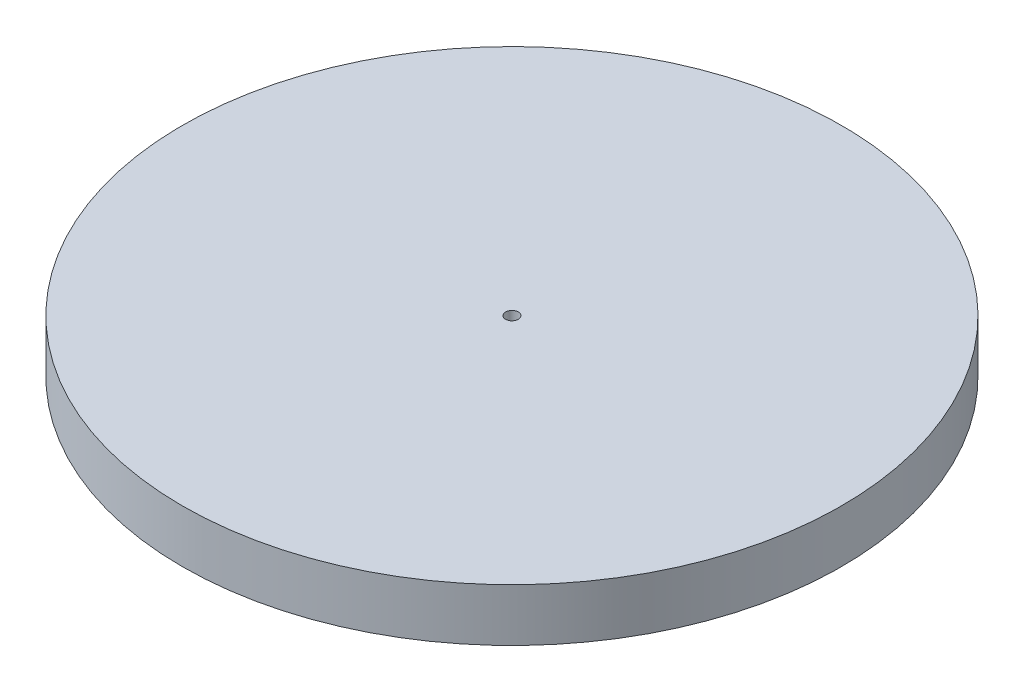
ISO-10303-21;
HEADER;
FILE_DESCRIPTION(('STEP AP214'),'2;1');
FILE_NAME('part.step','',(''),(''),'','','');
FILE_SCHEMA(('AUTOMOTIVE_DESIGN { 1 0 10303 214 1 1 1 1 }'));
ENDSEC;
DATA;
#1=APPLICATION_CONTEXT('core data for automotive mechanical design processes');
#2=APPLICATION_PROTOCOL_DEFINITION('international standard','automotive_design',2000,#1);
#3=PRODUCT_CONTEXT('',#1,'mechanical');
#4=PRODUCT('Part','Part','',(#3));
#5=PRODUCT_RELATED_PRODUCT_CATEGORY('part','',(#4));
#6=PRODUCT_DEFINITION_FORMATION('','',#4);
#7=PRODUCT_DEFINITION_CONTEXT('part definition',#1,'design');
#8=PRODUCT_DEFINITION('design','',#6,#7);
#9=PRODUCT_DEFINITION_SHAPE('','',#8);
#10=(LENGTH_UNIT() NAMED_UNIT(*) SI_UNIT(.MILLI.,.METRE.));
#11=(NAMED_UNIT(*) PLANE_ANGLE_UNIT() SI_UNIT($,.RADIAN.));
#12=(NAMED_UNIT(*) SI_UNIT($,.STERADIAN.) SOLID_ANGLE_UNIT());
#13=UNCERTAINTY_MEASURE_WITH_UNIT(LENGTH_MEASURE(1.E-05),#10,'distance_accuracy_value','');
#14=(GEOMETRIC_REPRESENTATION_CONTEXT(3) GLOBAL_UNCERTAINTY_ASSIGNED_CONTEXT((#13)) GLOBAL_UNIT_ASSIGNED_CONTEXT((#10,
#11,#12)) REPRESENTATION_CONTEXT('',''));
#15=CARTESIAN_POINT('',(0.,0.,0.));
#16=DIRECTION('',(0.,0.,1.));
#17=DIRECTION('',(1.,0.,0.));
#18=AXIS2_PLACEMENT_3D('',#15,#16,#17);
#19=CARTESIAN_POINT('',(-1.66935369233034E-12,0.,0.));
#20=CARTESIAN_POINT('',(0.0160193190524228,-0.000318054856775744,0.));
#21=CARTESIAN_POINT('',(0.0473639566251672,-0.000435510550509003,0.));
#22=CARTESIAN_POINT('',(0.124565154527215,0.000266609481892512,0.));
#23=CARTESIAN_POINT('',(0.188009447782362,0.00478488924538861,0.));
#24=CARTESIAN_POINT('',(0.302162396783634,0.014312965244326,0.));
#25=CARTESIAN_POINT('',(0.434906427325045,0.0337053179774558,0.));
#26=CARTESIAN_POINT('',(0.591621889336675,0.064644454449584,0.));
#27=CARTESIAN_POINT('',(0.758367432559395,0.10898808388091,0.));
#28=CARTESIAN_POINT('',(0.948542261906713,0.167874068193784,0.));
#29=CARTESIAN_POINT('',(1.14842191793434,0.240807637396926,0.));
#30=CARTESIAN_POINT('',(1.37199511300923,0.333716385655303,0.));
#31=CARTESIAN_POINT('',(1.61633285204612,0.447951627884762,0.));
#32=CARTESIAN_POINT('',(1.84949067280304,0.56620763699856,0.));
#33=CARTESIAN_POINT('',(2.08788871807308,0.695473703724883,0.));
#34=CARTESIAN_POINT('',(2.3320591278058,0.835246825901475,0.));
#35=CARTESIAN_POINT('',(2.58184161033338,0.985088881639972,0.));
#36=CARTESIAN_POINT('',(2.83752543271208,1.14450063522169,0.));
#37=CARTESIAN_POINT('',(3.28091081632111,1.42994042502417,0.));
#38=CARTESIAN_POINT('',(3.98720303124764,1.90885241036084,0.));
#39=CARTESIAN_POINT('',(4.78289528664414,2.47902436951218,0.));
#40=CARTESIAN_POINT('',(5.67017795522472,3.13576814221697,0.));
#41=CARTESIAN_POINT('',(6.95211968249608,4.10259363400245,0.));
#42=CARTESIAN_POINT('',(8.54259141017841,5.32584584689984,0.));
#43=CARTESIAN_POINT('',(10.6041959334969,6.92559694324808,0.));
#44=CARTESIAN_POINT('',(12.8265834223268,8.64299328127692,0.));
#45=CARTESIAN_POINT('',(14.7393250682949,10.1080268866887,0.));
#46=CARTESIAN_POINT('',(16.6560805223715,11.5628348770098,0.));
#47=CARTESIAN_POINT('',(18.2636412114255,12.770152933313,0.));
#48=CARTESIAN_POINT('',(19.8694312602965,13.9632472606054,0.));
#49=CARTESIAN_POINT('',(21.4945573297555,15.1564003029726,0.));
#50=CARTESIAN_POINT('',(22.7794973285683,16.0923400899708,0.));
#51=CARTESIAN_POINT('',(24.1049555139759,17.0475744908639,0.));
#52=CARTESIAN_POINT('',(25.3717523625864,17.9540927974031,0.));
#53=CARTESIAN_POINT('',(27.0889047476091,19.1684619765692,0.));
#54=CARTESIAN_POINT('',(28.2529017866212,19.9854061201744,0.));
#55=CARTESIAN_POINT('',(29.4493043905454,20.8124595028871,0.));
#56=CARTESIAN_POINT('',(30.0000000000689,21.1926006575352,0.));
#57=B_SPLINE_CURVE_WITH_KNOTS('',4,(#19,#20,#21,#22,#23,#24,#25,#26,#27,#28,#29,#30,#31,#32,#33,
#34,#35,#36,#37,#38,#39,#40,#41,#42,#43,#44,#45,#46,#47,#48,#49,#50,#51,#52,#53,#54,#55,#56),
.UNSPECIFIED.,.F.,.F.,(5,1,1,1,1,1,1,1,1,1,1,1,1,1,1,1,1,1,1,1,1,1,1,1,1,1,1,1,1,1,1,1,1,1,5),
(0.0832282933178679,0.0849668084394803,0.0867053235610927,0.088443838682705,0.0901823538043174,
0.0947159816381905,0.0992496094720637,0.102595876988796,0.105942144505529,0.112634679538994,
0.118542034753024,0.124449389967053,0.130356745181083,0.136264100395113,0.143077265738694,
0.149890431082276,0.156703596425858,0.16351676176944,0.190769423143767,0.227072871122881,
0.245224595112438,0.263376319101995,0.335983215624438,0.408590105179713,0.481196988245663,
0.517500432975978,0.553803877706294,0.626410759768741,0.662714204314046,0.69901764885935,
0.735321089529334,0.771624530199317,0.80792797418639,0.844231418173463,0.916838297047539),.UNSPECIFIED.);
#58=CARTESIAN_POINT('',(0.,40.,0.));
#59=DIRECTION('',(0.,1.,0.));
#60=AXIS1_PLACEMENT('',#58,#59);
#61=SURFACE_OF_REVOLUTION('',#57,#60);
#62=CARTESIAN_POINT('',(0.,0.263779101853469,0.));
#63=DIRECTION('',(0.,1.,0.));
#64=DIRECTION('',(0.,0.,1.));
#65=AXIS2_PLACEMENT_3D('',#62,#63,#64);
#66=CIRCLE('',#65,1.2);
#67=CARTESIAN_POINT('',(0.,0.263779101853469,1.2));
#68=VERTEX_POINT('',#67);
#69=EDGE_CURVE('E61',#68,#68,#66,.T.);
#70=ORIENTED_EDGE('',*,*,#69,.T.);
#71=EDGE_LOOP('',(#70));
#72=FACE_BOUND('',#71,.T.);
#73=CARTESIAN_POINT('',(0.,21.1926006574876,0.));
#74=DIRECTION('',(0.,1.,0.));
#75=DIRECTION('',(0.,0.,1.));
#76=AXIS2_PLACEMENT_3D('',#73,#74,#75);
#77=CIRCLE('',#76,30.);
#78=CARTESIAN_POINT('',(0.,21.1926006574876,30.));
#79=VERTEX_POINT('',#78);
#80=EDGE_CURVE('E58',#79,#79,#77,.T.);
#81=ORIENTED_EDGE('',*,*,#80,.F.);
#82=EDGE_LOOP('',(#81));
#83=FACE_BOUND('',#82,.T.);
#84=ADVANCED_FACE('F35',(#72,#83),#61,.T.);
#85=CARTESIAN_POINT('',(0.,40.,0.));
#86=DIRECTION('',(0.,1.,0.));
#87=DIRECTION('',(0.,0.,1.));
#88=AXIS2_PLACEMENT_3D('',#85,#86,#87);
#89=CYLINDRICAL_SURFACE('',#88,1.2);
#90=CARTESIAN_POINT('',(0.,40.,0.));
#91=DIRECTION('',(0.,1.,0.));
#92=DIRECTION('',(0.,0.,1.));
#93=AXIS2_PLACEMENT_3D('',#90,#91,#92);
#94=CIRCLE('',#93,1.2);
#95=CARTESIAN_POINT('',(0.,40.,1.2));
#96=VERTEX_POINT('',#95);
#97=EDGE_CURVE('E10',#96,#96,#94,.T.);
#98=ORIENTED_EDGE('',*,*,#97,.T.);
#99=EDGE_LOOP('',(#98));
#100=FACE_BOUND('',#99,.T.);
#101=ORIENTED_EDGE('',*,*,#69,.F.);
#102=EDGE_LOOP('',(#101));
#103=FACE_BOUND('',#102,.T.);
#104=ADVANCED_FACE('F86',(#100,#103),#89,.F.);
#105=CARTESIAN_POINT('',(1.2,40.,0.));
#106=DIRECTION('',(0.,-1.,0.));
#107=DIRECTION('',(0.,0.,-1.));
#108=AXIS2_PLACEMENT_3D('',#105,#106,#107);
#109=PLANE('',#108);
#110=ORIENTED_EDGE('',*,*,#97,.F.);
#111=EDGE_LOOP('',(#110));
#112=FACE_BOUND('',#111,.T.);
#113=CARTESIAN_POINT('',(0.,40.,0.));
#114=DIRECTION('',(0.,1.,0.));
#115=DIRECTION('',(0.,0.,1.));
#116=AXIS2_PLACEMENT_3D('',#113,#114,#115);
#117=CIRCLE('',#116,62.);
#118=CARTESIAN_POINT('',(0.,40.,62.));
#119=VERTEX_POINT('',#118);
#120=EDGE_CURVE('E42',#119,#119,#117,.T.);
#121=ORIENTED_EDGE('',*,*,#120,.T.);
#122=EDGE_LOOP('',(#121));
#123=FACE_BOUND('',#122,.T.);
#124=ADVANCED_FACE('F83',(#112,#123),#109,.F.);
#125=CARTESIAN_POINT('',(0.,40.,0.));
#126=DIRECTION('',(0.,1.,0.));
#127=DIRECTION('',(0.,0.,1.));
#128=AXIS2_PLACEMENT_3D('',#125,#126,#127);
#129=CYLINDRICAL_SURFACE('',#128,62.);
#130=ORIENTED_EDGE('',*,*,#120,.F.);
#131=EDGE_LOOP('',(#130));
#132=FACE_BOUND('',#131,.T.);
#133=CARTESIAN_POINT('',(0.,30.095100636454,0.));
#134=DIRECTION('',(0.,1.,0.));
#135=DIRECTION('',(0.,0.,1.));
#136=AXIS2_PLACEMENT_3D('',#133,#134,#135);
#137=CIRCLE('',#136,62.);
#138=CARTESIAN_POINT('',(0.,30.095100636454,62.));
#139=VERTEX_POINT('',#138);
#140=EDGE_CURVE('E46',#139,#139,#137,.T.);
#141=ORIENTED_EDGE('',*,*,#140,.T.);
#142=EDGE_LOOP('',(#141));
#143=FACE_BOUND('',#142,.T.);
#144=ADVANCED_FACE('F78',(#132,#143),#129,.T.);
#145=CARTESIAN_POINT('',(31.9999999999999,22.1926006574876,0.));
#146=CARTESIAN_POINT('',(32.1629157021524,22.2326668438612,0.));
#147=CARTESIAN_POINT('',(32.4889586543318,22.3131151156363,0.));
#148=CARTESIAN_POINT('',(33.2632121565499,22.5046896325125,0.));
#149=CARTESIAN_POINT('',(33.899427502248,22.66414321834,0.));
#150=CARTESIAN_POINT('',(34.7645312935642,22.8812399546629,0.));
#151=CARTESIAN_POINT('',(35.5999190469274,23.093016172034,0.));
#152=CARTESIAN_POINT('',(36.6077097098706,23.3495663526376,0.));
#153=CARTESIAN_POINT('',(37.6660187654636,23.6214496445342,0.));
#154=CARTESIAN_POINT('',(38.8423363374639,23.9253725831907,0.));
#155=CARTESIAN_POINT('',(40.0087090561654,24.2289334966484,0.));
#156=CARTESIAN_POINT('',(41.2779303293989,24.5608592524665,0.));
#157=CARTESIAN_POINT('',(42.8554617768937,24.97588904089,0.));
#158=CARTESIAN_POINT('',(44.6857658635404,25.4600962508283,0.));
#159=CARTESIAN_POINT('',(46.8778587029911,26.0434803124416,0.));
#160=CARTESIAN_POINT('',(49.1389526623305,26.647832785985,0.));
#161=CARTESIAN_POINT('',(51.5787710914451,27.3016695111623,0.));
#162=CARTESIAN_POINT('',(53.7333756071195,27.8802121625001,0.));
#163=CARTESIAN_POINT('',(56.3517380386612,28.5826942545571,0.));
#164=CARTESIAN_POINT('',(58.2068600386716,29.0808089881071,0.));
#165=CARTESIAN_POINT('',(60.5424545507018,29.7056482259504,0.));
#166=CARTESIAN_POINT('',(61.5137247301818,29.9652627343669,0.));
#167=CARTESIAN_POINT('',(61.9999999999623,30.0951006364437,0.));
#168=B_SPLINE_CURVE_WITH_KNOTS('',4,(#145,#146,#147,#148,#149,#150,#151,#152,#153,#154,#155,
#156,#157,#158,#159,#160,#161,#162,#163,#164,#165,#166,#167),.UNSPECIFIED.,.F.,.F.,(5,1,1,1,1,1,
1,1,1,1,1,1,1,1,1,1,1,1,1,5),(0.0830034141458264,0.104634507584641,0.126265606614812,
0.147896704059688,0.169527800315883,0.19165091381168,0.224097560557757,0.256544207205548,
0.288990852399049,0.32143750012757,0.353884144674545,0.398191872953252,0.463085165310033,
0.52797845763756,0.592871749705123,0.65776504182557,0.722658334011543,0.787551626182135,
0.852444918274078,0.917338210265908),.UNSPECIFIED.);
#169=CARTESIAN_POINT('',(0.,40.,0.));
#170=DIRECTION('',(0.,1.,0.));
#171=AXIS1_PLACEMENT('',#169,#170);
#172=SURFACE_OF_REVOLUTION('',#168,#171);
#173=ORIENTED_EDGE('',*,*,#140,.F.);
#174=EDGE_LOOP('',(#173));
#175=FACE_BOUND('',#174,.T.);
#176=CARTESIAN_POINT('',(0.,22.1926006574876,0.));
#177=DIRECTION('',(0.,1.,0.));
#178=DIRECTION('',(0.,0.,1.));
#179=AXIS2_PLACEMENT_3D('',#176,#177,#178);
#180=CIRCLE('',#179,31.9999999999999);
#181=CARTESIAN_POINT('',(0.,22.1926006574876,31.9999999999999));
#182=VERTEX_POINT('',#181);
#183=EDGE_CURVE('E50',#182,#182,#180,.T.);
#184=ORIENTED_EDGE('',*,*,#183,.T.);
#185=EDGE_LOOP('',(#184));
#186=FACE_BOUND('',#185,.T.);
#187=ADVANCED_FACE('F73',(#175,#186),#172,.T.);
#188=CARTESIAN_POINT('',(30.,22.1926006574876,0.));
#189=DIRECTION('',(0.,1.,0.));
#190=DIRECTION('',(0.,0.,1.));
#191=AXIS2_PLACEMENT_3D('',#188,#189,#190);
#192=PLANE('',#191);
#193=ORIENTED_EDGE('',*,*,#183,.F.);
#194=EDGE_LOOP('',(#193));
#195=FACE_BOUND('',#194,.T.);
#196=CARTESIAN_POINT('',(0.,22.1926006574876,0.));
#197=DIRECTION('',(0.,1.,0.));
#198=DIRECTION('',(0.,0.,1.));
#199=AXIS2_PLACEMENT_3D('',#196,#197,#198);
#200=CIRCLE('',#199,30.);
#201=CARTESIAN_POINT('',(0.,22.1926006574876,30.));
#202=VERTEX_POINT('',#201);
#203=EDGE_CURVE('E55',#202,#202,#200,.T.);
#204=ORIENTED_EDGE('',*,*,#203,.T.);
#205=EDGE_LOOP('',(#204));
#206=FACE_BOUND('',#205,.T.);
#207=ADVANCED_FACE('F77',(#195,#206),#192,.F.);
#208=CARTESIAN_POINT('',(0.,40.,0.));
#209=DIRECTION('',(0.,1.,0.));
#210=DIRECTION('',(0.,0.,1.));
#211=AXIS2_PLACEMENT_3D('',#208,#209,#210);
#212=CYLINDRICAL_SURFACE('',#211,30.);
#213=ORIENTED_EDGE('',*,*,#203,.F.);
#214=EDGE_LOOP('',(#213));
#215=FACE_BOUND('',#214,.T.);
#216=ORIENTED_EDGE('',*,*,#80,.T.);
#217=EDGE_LOOP('',(#216));
#218=FACE_BOUND('',#217,.T.);
#219=ADVANCED_FACE('F99',(#215,#218),#212,.T.);
#220=CLOSED_SHELL('',(#84,#104,#124,#144,#187,#207,#219));
#221=MANIFOLD_SOLID_BREP('B2',#220);
#222=ADVANCED_BREP_SHAPE_REPRESENTATION('',(#18,#221),#14);
#223=SHAPE_DEFINITION_REPRESENTATION(#9,#222);
ENDSEC;
END-ISO-10303-21;
